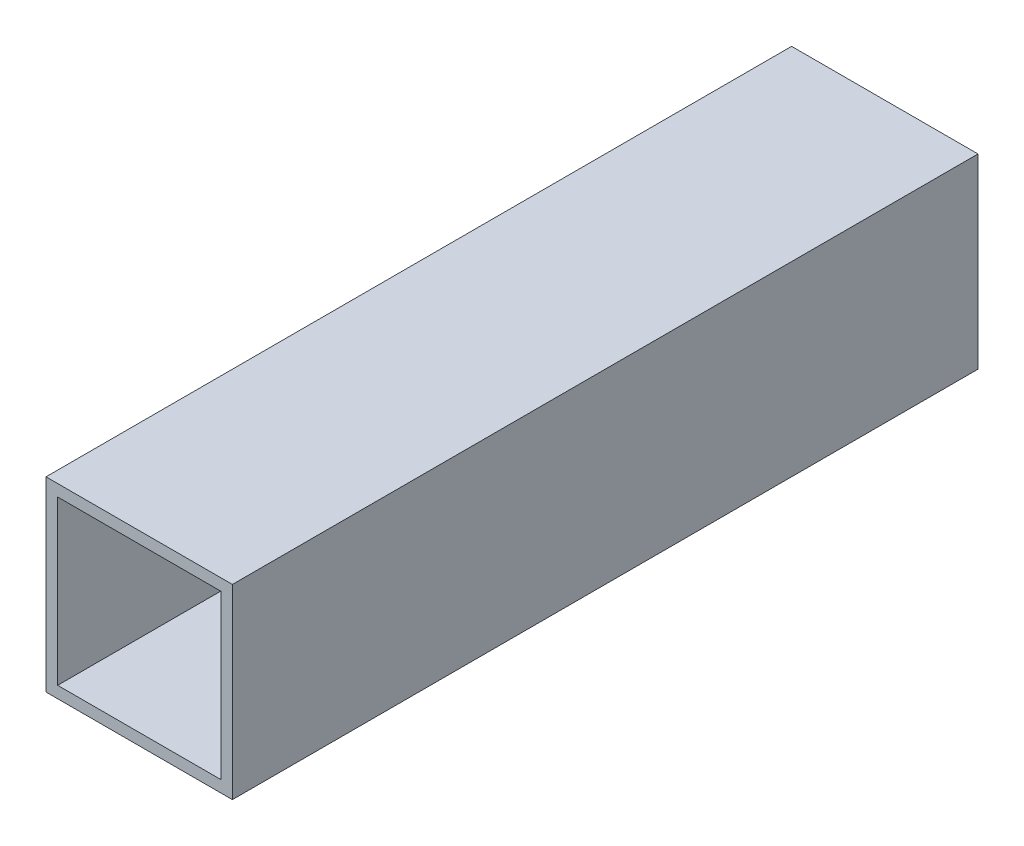
ISO-10303-21;
HEADER;
FILE_DESCRIPTION(('STEP AP214'),'2;1');
FILE_NAME('part.step','',(''),(''),'','','');
FILE_SCHEMA(('AUTOMOTIVE_DESIGN { 1 0 10303 214 1 1 1 1 }'));
ENDSEC;
DATA;
#1=APPLICATION_CONTEXT('core data for automotive mechanical design processes');
#2=APPLICATION_PROTOCOL_DEFINITION('international standard','automotive_design',2000,#1);
#3=PRODUCT_CONTEXT('',#1,'mechanical');
#4=PRODUCT('Part','Part','',(#3));
#5=PRODUCT_RELATED_PRODUCT_CATEGORY('part','',(#4));
#6=PRODUCT_DEFINITION_FORMATION('','',#4);
#7=PRODUCT_DEFINITION_CONTEXT('part definition',#1,'design');
#8=PRODUCT_DEFINITION('design','',#6,#7);
#9=PRODUCT_DEFINITION_SHAPE('','',#8);
#10=(LENGTH_UNIT() NAMED_UNIT(*) SI_UNIT(.MILLI.,.METRE.));
#11=(NAMED_UNIT(*) PLANE_ANGLE_UNIT() SI_UNIT($,.RADIAN.));
#12=(NAMED_UNIT(*) SI_UNIT($,.STERADIAN.) SOLID_ANGLE_UNIT());
#13=UNCERTAINTY_MEASURE_WITH_UNIT(LENGTH_MEASURE(1.E-05),#10,'distance_accuracy_value','');
#14=(GEOMETRIC_REPRESENTATION_CONTEXT(3) GLOBAL_UNCERTAINTY_ASSIGNED_CONTEXT((#13)) GLOBAL_UNIT_ASSIGNED_CONTEXT((#10,
#11,#12)) REPRESENTATION_CONTEXT('',''));
#15=CARTESIAN_POINT('',(0.,0.,0.));
#16=DIRECTION('',(0.,0.,1.));
#17=DIRECTION('',(1.,0.,0.));
#18=AXIS2_PLACEMENT_3D('',#15,#16,#17);
#19=CARTESIAN_POINT('',(0.,0.,101.6));
#20=DIRECTION('',(0.,0.,-1.));
#21=DIRECTION('',(-1.,0.,0.));
#22=AXIS2_PLACEMENT_3D('',#19,#20,#21);
#23=PLANE('',#22);
#24=DIRECTION('',(0.,-1.,0.));
#25=VECTOR('',#24,1.);
#26=CARTESIAN_POINT('',(-12.7,12.7,101.6));
#27=LINE('',#26,#25);
#28=CARTESIAN_POINT('',(-12.7,12.7,101.6));
#29=VERTEX_POINT('',#28);
#30=CARTESIAN_POINT('',(-12.7,-12.7,101.6));
#31=VERTEX_POINT('',#30);
#32=EDGE_CURVE('E133',#29,#31,#27,.T.);
#33=ORIENTED_EDGE('',*,*,#32,.T.);
#34=DIRECTION('',(1.,0.,0.));
#35=VECTOR('',#34,1.);
#36=CARTESIAN_POINT('',(12.7,-12.7,101.6));
#37=LINE('',#36,#35);
#38=CARTESIAN_POINT('',(12.7,-12.7,101.6));
#39=VERTEX_POINT('',#38);
#40=EDGE_CURVE('E136',#31,#39,#37,.T.);
#41=ORIENTED_EDGE('',*,*,#40,.T.);
#42=DIRECTION('',(0.,1.,0.));
#43=VECTOR('',#42,1.);
#44=CARTESIAN_POINT('',(12.7,12.7,101.6));
#45=LINE('',#44,#43);
#46=CARTESIAN_POINT('',(12.7,12.7,101.6));
#47=VERTEX_POINT('',#46);
#48=EDGE_CURVE('E139',#39,#47,#45,.T.);
#49=ORIENTED_EDGE('',*,*,#48,.T.);
#50=DIRECTION('',(-1.,0.,0.));
#51=VECTOR('',#50,1.);
#52=CARTESIAN_POINT('',(12.7,12.7,101.6));
#53=LINE('',#52,#51);
#54=EDGE_CURVE('E141',#47,#29,#53,.T.);
#55=ORIENTED_EDGE('',*,*,#54,.T.);
#56=EDGE_LOOP('',(#33,#41,#49,#55));
#57=FACE_BOUND('',#56,.T.);
#58=DIRECTION('',(0.,-1.,0.));
#59=VECTOR('',#58,1.);
#60=CARTESIAN_POINT('',(-11.1125,11.1125,101.6));
#61=LINE('',#60,#59);
#62=CARTESIAN_POINT('',(-11.1125,11.1125,101.6));
#63=VERTEX_POINT('',#62);
#64=CARTESIAN_POINT('',(-11.1125,-11.1125,101.6));
#65=VERTEX_POINT('',#64);
#66=EDGE_CURVE('E97',#63,#65,#61,.T.);
#67=ORIENTED_EDGE('',*,*,#66,.F.);
#68=DIRECTION('',(-1.,0.,0.));
#69=VECTOR('',#68,1.);
#70=CARTESIAN_POINT('',(11.1125,11.1125,101.6));
#71=LINE('',#70,#69);
#72=CARTESIAN_POINT('',(11.1125,11.1125,101.6));
#73=VERTEX_POINT('',#72);
#74=EDGE_CURVE('E119',#73,#63,#71,.T.);
#75=ORIENTED_EDGE('',*,*,#74,.F.);
#76=DIRECTION('',(0.,1.,0.));
#77=VECTOR('',#76,1.);
#78=CARTESIAN_POINT('',(11.1125,11.1125,101.6));
#79=LINE('',#78,#77);
#80=CARTESIAN_POINT('',(11.1125,-11.1125,101.6));
#81=VERTEX_POINT('',#80);
#82=EDGE_CURVE('E117',#81,#73,#79,.T.);
#83=ORIENTED_EDGE('',*,*,#82,.F.);
#84=DIRECTION('',(1.,0.,0.));
#85=VECTOR('',#84,1.);
#86=CARTESIAN_POINT('',(11.1125,-11.1125,101.6));
#87=LINE('',#86,#85);
#88=EDGE_CURVE('E105',#65,#81,#87,.T.);
#89=ORIENTED_EDGE('',*,*,#88,.F.);
#90=EDGE_LOOP('',(#67,#75,#83,#89));
#91=FACE_BOUND('',#90,.T.);
#92=ADVANCED_FACE('F32',(#57,#91),#23,.F.);
#93=CARTESIAN_POINT('',(0.,0.,0.));
#94=DIRECTION('',(0.,0.,-1.));
#95=DIRECTION('',(-1.,0.,0.));
#96=AXIS2_PLACEMENT_3D('',#93,#94,#95);
#97=PLANE('',#96);
#98=DIRECTION('',(0.,-1.,0.));
#99=VECTOR('',#98,1.);
#100=CARTESIAN_POINT('',(-12.7,12.7,0.));
#101=LINE('',#100,#99);
#102=CARTESIAN_POINT('',(-12.7,12.7,0.));
#103=VERTEX_POINT('',#102);
#104=CARTESIAN_POINT('',(-12.7,-12.7,0.));
#105=VERTEX_POINT('',#104);
#106=EDGE_CURVE('E113',#103,#105,#101,.T.);
#107=ORIENTED_EDGE('',*,*,#106,.F.);
#108=DIRECTION('',(-1.,0.,0.));
#109=VECTOR('',#108,1.);
#110=CARTESIAN_POINT('',(12.7,12.7,0.));
#111=LINE('',#110,#109);
#112=CARTESIAN_POINT('',(12.7,12.7,0.));
#113=VERTEX_POINT('',#112);
#114=EDGE_CURVE('E137',#113,#103,#111,.T.);
#115=ORIENTED_EDGE('',*,*,#114,.F.);
#116=DIRECTION('',(0.,1.,0.));
#117=VECTOR('',#116,1.);
#118=CARTESIAN_POINT('',(12.7,12.7,0.));
#119=LINE('',#118,#117);
#120=CARTESIAN_POINT('',(12.7,-12.7,0.));
#121=VERTEX_POINT('',#120);
#122=EDGE_CURVE('E148',#121,#113,#119,.T.);
#123=ORIENTED_EDGE('',*,*,#122,.F.);
#124=DIRECTION('',(1.,0.,0.));
#125=VECTOR('',#124,1.);
#126=CARTESIAN_POINT('',(12.7,-12.7,0.));
#127=LINE('',#126,#125);
#128=EDGE_CURVE('E146',#105,#121,#127,.T.);
#129=ORIENTED_EDGE('',*,*,#128,.F.);
#130=EDGE_LOOP('',(#107,#115,#123,#129));
#131=FACE_BOUND('',#130,.T.);
#132=DIRECTION('',(-1.,0.,0.));
#133=VECTOR('',#132,1.);
#134=CARTESIAN_POINT('',(11.1125,11.1125,0.));
#135=LINE('',#134,#133);
#136=CARTESIAN_POINT('',(11.1125,11.1125,0.));
#137=VERTEX_POINT('',#136);
#138=CARTESIAN_POINT('',(-11.1125,11.1125,0.));
#139=VERTEX_POINT('',#138);
#140=EDGE_CURVE('E106',#137,#139,#135,.T.);
#141=ORIENTED_EDGE('',*,*,#140,.T.);
#142=DIRECTION('',(0.,-1.,0.));
#143=VECTOR('',#142,1.);
#144=CARTESIAN_POINT('',(-11.1125,11.1125,0.));
#145=LINE('',#144,#143);
#146=CARTESIAN_POINT('',(-11.1125,-11.1125,0.));
#147=VERTEX_POINT('',#146);
#148=EDGE_CURVE('E55',#139,#147,#145,.T.);
#149=ORIENTED_EDGE('',*,*,#148,.T.);
#150=DIRECTION('',(1.,0.,0.));
#151=VECTOR('',#150,1.);
#152=CARTESIAN_POINT('',(11.1125,-11.1125,0.));
#153=LINE('',#152,#151);
#154=CARTESIAN_POINT('',(11.1125,-11.1125,0.));
#155=VERTEX_POINT('',#154);
#156=EDGE_CURVE('E112',#147,#155,#153,.T.);
#157=ORIENTED_EDGE('',*,*,#156,.T.);
#158=DIRECTION('',(0.,1.,0.));
#159=VECTOR('',#158,1.);
#160=CARTESIAN_POINT('',(11.1125,11.1125,0.));
#161=LINE('',#160,#159);
#162=EDGE_CURVE('E125',#155,#137,#161,.T.);
#163=ORIENTED_EDGE('',*,*,#162,.T.);
#164=EDGE_LOOP('',(#141,#149,#157,#163));
#165=FACE_BOUND('',#164,.T.);
#166=ADVANCED_FACE('F166',(#131,#165),#97,.T.);
#167=CARTESIAN_POINT('',(-12.7,12.7,101.6));
#168=DIRECTION('',(1.,0.,0.));
#169=DIRECTION('',(0.,0.,-1.));
#170=AXIS2_PLACEMENT_3D('',#167,#168,#169);
#171=PLANE('',#170);
#172=ORIENTED_EDGE('',*,*,#106,.T.);
#173=DIRECTION('',(0.,0.,-1.));
#174=VECTOR('',#173,1.);
#175=CARTESIAN_POINT('',(-12.7,-12.7,101.6));
#176=LINE('',#175,#174);
#177=EDGE_CURVE('E11',#31,#105,#176,.T.);
#178=ORIENTED_EDGE('',*,*,#177,.F.);
#179=ORIENTED_EDGE('',*,*,#32,.F.);
#180=DIRECTION('',(0.,0.,-1.));
#181=VECTOR('',#180,1.);
#182=CARTESIAN_POINT('',(-12.7,12.7,101.6));
#183=LINE('',#182,#181);
#184=EDGE_CURVE('E143',#29,#103,#183,.T.);
#185=ORIENTED_EDGE('',*,*,#184,.T.);
#186=EDGE_LOOP('',(#172,#178,#179,#185));
#187=FACE_BOUND('',#186,.T.);
#188=ADVANCED_FACE('F34',(#187),#171,.F.);
#189=CARTESIAN_POINT('',(12.7,-12.7,101.6));
#190=DIRECTION('',(0.,1.,0.));
#191=DIRECTION('',(-1.,0.,0.));
#192=AXIS2_PLACEMENT_3D('',#189,#190,#191);
#193=PLANE('',#192);
#194=ORIENTED_EDGE('',*,*,#128,.T.);
#195=DIRECTION('',(0.,0.,-1.));
#196=VECTOR('',#195,1.);
#197=CARTESIAN_POINT('',(12.7,-12.7,101.6));
#198=LINE('',#197,#196);
#199=EDGE_CURVE('E40',#39,#121,#198,.T.);
#200=ORIENTED_EDGE('',*,*,#199,.F.);
#201=ORIENTED_EDGE('',*,*,#40,.F.);
#202=ORIENTED_EDGE('',*,*,#177,.T.);
#203=EDGE_LOOP('',(#194,#200,#201,#202));
#204=FACE_BOUND('',#203,.T.);
#205=ADVANCED_FACE('F176',(#204),#193,.F.);
#206=CARTESIAN_POINT('',(12.7,12.7,101.6));
#207=DIRECTION('',(-1.,0.,0.));
#208=DIRECTION('',(0.,0.,1.));
#209=AXIS2_PLACEMENT_3D('',#206,#207,#208);
#210=PLANE('',#209);
#211=ORIENTED_EDGE('',*,*,#122,.T.);
#212=DIRECTION('',(0.,0.,-1.));
#213=VECTOR('',#212,1.);
#214=CARTESIAN_POINT('',(12.7,12.7,101.6));
#215=LINE('',#214,#213);
#216=EDGE_CURVE('E153',#47,#113,#215,.T.);
#217=ORIENTED_EDGE('',*,*,#216,.F.);
#218=ORIENTED_EDGE('',*,*,#48,.F.);
#219=ORIENTED_EDGE('',*,*,#199,.T.);
#220=EDGE_LOOP('',(#211,#217,#218,#219));
#221=FACE_BOUND('',#220,.T.);
#222=ADVANCED_FACE('F160',(#221),#210,.F.);
#223=CARTESIAN_POINT('',(12.7,12.7,101.6));
#224=DIRECTION('',(0.,-1.,0.));
#225=DIRECTION('',(1.,0.,0.));
#226=AXIS2_PLACEMENT_3D('',#223,#224,#225);
#227=PLANE('',#226);
#228=ORIENTED_EDGE('',*,*,#114,.T.);
#229=ORIENTED_EDGE('',*,*,#184,.F.);
#230=ORIENTED_EDGE('',*,*,#54,.F.);
#231=ORIENTED_EDGE('',*,*,#216,.T.);
#232=EDGE_LOOP('',(#228,#229,#230,#231));
#233=FACE_BOUND('',#232,.T.);
#234=ADVANCED_FACE('F170',(#233),#227,.F.);
#235=CARTESIAN_POINT('',(-11.1125,11.1125,101.6));
#236=DIRECTION('',(1.,0.,0.));
#237=DIRECTION('',(0.,0.,-1.));
#238=AXIS2_PLACEMENT_3D('',#235,#236,#237);
#239=PLANE('',#238);
#240=ORIENTED_EDGE('',*,*,#148,.F.);
#241=DIRECTION('',(0.,0.,-1.));
#242=VECTOR('',#241,1.);
#243=CARTESIAN_POINT('',(-11.1125,11.1125,101.6));
#244=LINE('',#243,#242);
#245=EDGE_CURVE('E101',#63,#139,#244,.T.);
#246=ORIENTED_EDGE('',*,*,#245,.F.);
#247=ORIENTED_EDGE('',*,*,#66,.T.);
#248=DIRECTION('',(0.,0.,-1.));
#249=VECTOR('',#248,1.);
#250=CARTESIAN_POINT('',(-11.1125,-11.1125,101.6));
#251=LINE('',#250,#249);
#252=EDGE_CURVE('E100',#65,#147,#251,.T.);
#253=ORIENTED_EDGE('',*,*,#252,.T.);
#254=EDGE_LOOP('',(#240,#246,#247,#253));
#255=FACE_BOUND('',#254,.T.);
#256=ADVANCED_FACE('F99',(#255),#239,.T.);
#257=CARTESIAN_POINT('',(11.1125,-11.1125,101.6));
#258=DIRECTION('',(0.,1.,0.));
#259=DIRECTION('',(0.,0.,1.));
#260=AXIS2_PLACEMENT_3D('',#257,#258,#259);
#261=PLANE('',#260);
#262=ORIENTED_EDGE('',*,*,#156,.F.);
#263=ORIENTED_EDGE('',*,*,#252,.F.);
#264=ORIENTED_EDGE('',*,*,#88,.T.);
#265=DIRECTION('',(0.,0.,-1.));
#266=VECTOR('',#265,1.);
#267=CARTESIAN_POINT('',(11.1125,-11.1125,101.6));
#268=LINE('',#267,#266);
#269=EDGE_CURVE('E114',#81,#155,#268,.T.);
#270=ORIENTED_EDGE('',*,*,#269,.T.);
#271=EDGE_LOOP('',(#262,#263,#264,#270));
#272=FACE_BOUND('',#271,.T.);
#273=ADVANCED_FACE('F109',(#272),#261,.T.);
#274=CARTESIAN_POINT('',(11.1125,11.1125,101.6));
#275=DIRECTION('',(-1.,0.,0.));
#276=DIRECTION('',(0.,0.,1.));
#277=AXIS2_PLACEMENT_3D('',#274,#275,#276);
#278=PLANE('',#277);
#279=ORIENTED_EDGE('',*,*,#162,.F.);
#280=ORIENTED_EDGE('',*,*,#269,.F.);
#281=ORIENTED_EDGE('',*,*,#82,.T.);
#282=DIRECTION('',(0.,0.,-1.));
#283=VECTOR('',#282,1.);
#284=CARTESIAN_POINT('',(11.1125,11.1125,101.6));
#285=LINE('',#284,#283);
#286=EDGE_CURVE('E47',#73,#137,#285,.T.);
#287=ORIENTED_EDGE('',*,*,#286,.T.);
#288=EDGE_LOOP('',(#279,#280,#281,#287));
#289=FACE_BOUND('',#288,.T.);
#290=ADVANCED_FACE('F199',(#289),#278,.T.);
#291=CARTESIAN_POINT('',(11.1125,11.1125,101.6));
#292=DIRECTION('',(0.,-1.,0.));
#293=DIRECTION('',(0.,0.,-1.));
#294=AXIS2_PLACEMENT_3D('',#291,#292,#293);
#295=PLANE('',#294);
#296=ORIENTED_EDGE('',*,*,#140,.F.);
#297=ORIENTED_EDGE('',*,*,#286,.F.);
#298=ORIENTED_EDGE('',*,*,#74,.T.);
#299=ORIENTED_EDGE('',*,*,#245,.T.);
#300=EDGE_LOOP('',(#296,#297,#298,#299));
#301=FACE_BOUND('',#300,.T.);
#302=ADVANCED_FACE('F203',(#301),#295,.T.);
#303=CLOSED_SHELL('',(#92,#166,#188,#205,#222,#234,#256,#273,#290,#302));
#304=MANIFOLD_SOLID_BREP('B2',#303);
#305=ADVANCED_BREP_SHAPE_REPRESENTATION('',(#18,#304),#14);
#306=SHAPE_DEFINITION_REPRESENTATION(#9,#305);
ENDSEC;
END-ISO-10303-21;
